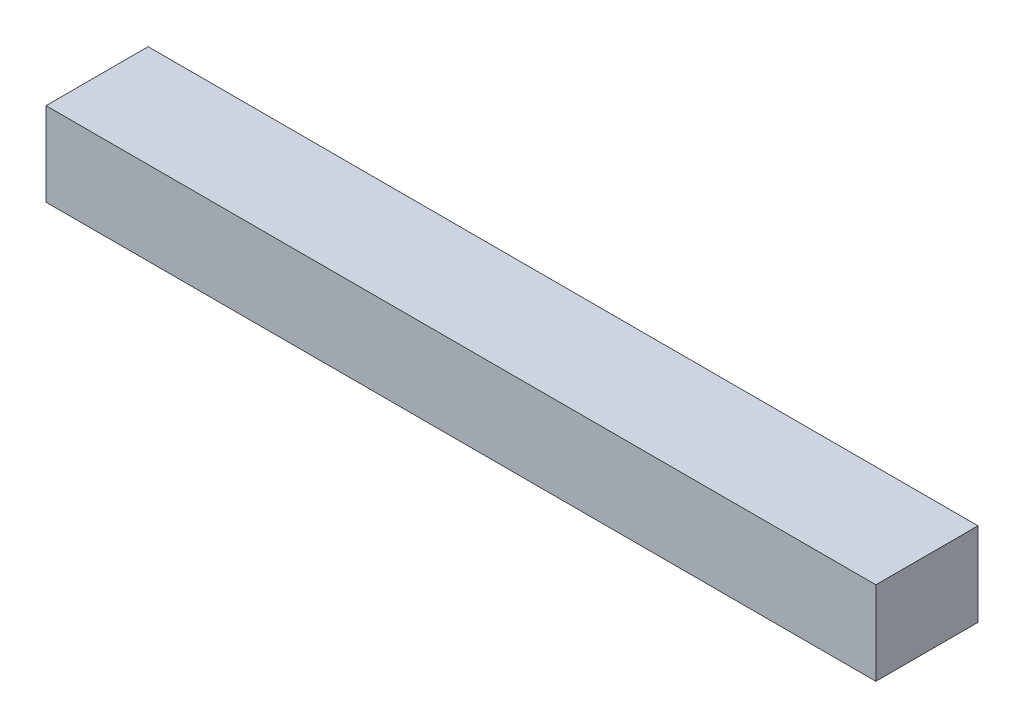
ISO-10303-21;
HEADER;
FILE_DESCRIPTION(('STEP AP214'),'2;1');
FILE_NAME('part.step','',(''),(''),'','','');
FILE_SCHEMA(('AUTOMOTIVE_DESIGN { 1 0 10303 214 1 1 1 1 }'));
ENDSEC;
DATA;
#1=APPLICATION_CONTEXT('core data for automotive mechanical design processes');
#2=APPLICATION_PROTOCOL_DEFINITION('international standard','automotive_design',2000,#1);
#3=PRODUCT_CONTEXT('',#1,'mechanical');
#4=PRODUCT('Part','Part','',(#3));
#5=PRODUCT_RELATED_PRODUCT_CATEGORY('part','',(#4));
#6=PRODUCT_DEFINITION_FORMATION('','',#4);
#7=PRODUCT_DEFINITION_CONTEXT('part definition',#1,'design');
#8=PRODUCT_DEFINITION('design','',#6,#7);
#9=PRODUCT_DEFINITION_SHAPE('','',#8);
#10=(LENGTH_UNIT() NAMED_UNIT(*) SI_UNIT(.MILLI.,.METRE.));
#11=(NAMED_UNIT(*) PLANE_ANGLE_UNIT() SI_UNIT($,.RADIAN.));
#12=(NAMED_UNIT(*) SI_UNIT($,.STERADIAN.) SOLID_ANGLE_UNIT());
#13=UNCERTAINTY_MEASURE_WITH_UNIT(LENGTH_MEASURE(1.E-05),#10,'distance_accuracy_value','');
#14=(GEOMETRIC_REPRESENTATION_CONTEXT(3) GLOBAL_UNCERTAINTY_ASSIGNED_CONTEXT((#13)) GLOBAL_UNIT_ASSIGNED_CONTEXT((#10,
#11,#12)) REPRESENTATION_CONTEXT('',''));
#15=CARTESIAN_POINT('',(0.,0.,0.));
#16=DIRECTION('',(0.,0.,1.));
#17=DIRECTION('',(1.,0.,0.));
#18=AXIS2_PLACEMENT_3D('',#15,#16,#17);
#19=CARTESIAN_POINT('',(2600.,0.,0.));
#20=DIRECTION('',(0.,0.,-1.));
#21=DIRECTION('',(-1.,0.,0.));
#22=AXIS2_PLACEMENT_3D('',#19,#20,#21);
#23=PLANE('',#22);
#24=DIRECTION('',(0.,-1.,0.));
#25=VECTOR('',#24,1.);
#26=CARTESIAN_POINT('',(0.,0.,0.));
#27=LINE('',#26,#25);
#28=CARTESIAN_POINT('',(0.,262.,0.));
#29=VERTEX_POINT('',#28);
#30=CARTESIAN_POINT('',(0.,0.,0.));
#31=VERTEX_POINT('',#30);
#32=EDGE_CURVE('E93',#29,#31,#27,.T.);
#33=ORIENTED_EDGE('',*,*,#32,.T.);
#34=DIRECTION('',(-1.,0.,0.));
#35=VECTOR('',#34,1.);
#36=CARTESIAN_POINT('',(2600.,0.,0.));
#37=LINE('',#36,#35);
#38=CARTESIAN_POINT('',(2600.,0.,0.));
#39=VERTEX_POINT('',#38);
#40=EDGE_CURVE('E11',#39,#31,#37,.T.);
#41=ORIENTED_EDGE('',*,*,#40,.F.);
#42=DIRECTION('',(0.,-1.,0.));
#43=VECTOR('',#42,1.);
#44=CARTESIAN_POINT('',(2600.,0.,0.));
#45=LINE('',#44,#43);
#46=CARTESIAN_POINT('',(2600.,262.,0.));
#47=VERTEX_POINT('',#46);
#48=EDGE_CURVE('E81',#47,#39,#45,.T.);
#49=ORIENTED_EDGE('',*,*,#48,.F.);
#50=DIRECTION('',(-1.,0.,0.));
#51=VECTOR('',#50,1.);
#52=CARTESIAN_POINT('',(2600.,262.,0.));
#53=LINE('',#52,#51);
#54=EDGE_CURVE('E89',#47,#29,#53,.T.);
#55=ORIENTED_EDGE('',*,*,#54,.T.);
#56=EDGE_LOOP('',(#33,#41,#49,#55));
#57=FACE_BOUND('',#56,.T.);
#58=ADVANCED_FACE('F30',(#57),#23,.F.);
#59=CARTESIAN_POINT('',(2600.,0.,0.));
#60=DIRECTION('',(0.,1.,0.));
#61=DIRECTION('',(0.,0.,1.));
#62=AXIS2_PLACEMENT_3D('',#59,#60,#61);
#63=PLANE('',#62);
#64=DIRECTION('',(0.,0.,-1.));
#65=VECTOR('',#64,1.);
#66=CARTESIAN_POINT('',(0.,0.,0.));
#67=LINE('',#66,#65);
#68=CARTESIAN_POINT('',(0.,0.,-320.));
#69=VERTEX_POINT('',#68);
#70=EDGE_CURVE('E85',#31,#69,#67,.T.);
#71=ORIENTED_EDGE('',*,*,#70,.T.);
#72=DIRECTION('',(-1.,0.,0.));
#73=VECTOR('',#72,1.);
#74=CARTESIAN_POINT('',(2600.,0.,-320.));
#75=LINE('',#74,#73);
#76=CARTESIAN_POINT('',(2600.,0.,-320.));
#77=VERTEX_POINT('',#76);
#78=EDGE_CURVE('E38',#77,#69,#75,.T.);
#79=ORIENTED_EDGE('',*,*,#78,.F.);
#80=DIRECTION('',(0.,0.,-1.));
#81=VECTOR('',#80,1.);
#82=CARTESIAN_POINT('',(2600.,0.,0.));
#83=LINE('',#82,#81);
#84=EDGE_CURVE('E76',#39,#77,#83,.T.);
#85=ORIENTED_EDGE('',*,*,#84,.F.);
#86=ORIENTED_EDGE('',*,*,#40,.T.);
#87=EDGE_LOOP('',(#71,#79,#85,#86));
#88=FACE_BOUND('',#87,.T.);
#89=ADVANCED_FACE('F84',(#88),#63,.F.);
#90=CARTESIAN_POINT('',(2600.,0.,-320.));
#91=DIRECTION('',(0.,0.,1.));
#92=DIRECTION('',(1.,0.,0.));
#93=AXIS2_PLACEMENT_3D('',#90,#91,#92);
#94=PLANE('',#93);
#95=DIRECTION('',(0.,1.,0.));
#96=VECTOR('',#95,1.);
#97=CARTESIAN_POINT('',(0.,0.,-320.));
#98=LINE('',#97,#96);
#99=CARTESIAN_POINT('',(0.,262.,-320.));
#100=VERTEX_POINT('',#99);
#101=EDGE_CURVE('E63',#69,#100,#98,.T.);
#102=ORIENTED_EDGE('',*,*,#101,.T.);
#103=DIRECTION('',(-1.,0.,0.));
#104=VECTOR('',#103,1.);
#105=CARTESIAN_POINT('',(2600.,262.,-320.));
#106=LINE('',#105,#104);
#107=CARTESIAN_POINT('',(2600.,262.,-320.));
#108=VERTEX_POINT('',#107);
#109=EDGE_CURVE('E86',#108,#100,#106,.T.);
#110=ORIENTED_EDGE('',*,*,#109,.F.);
#111=DIRECTION('',(0.,1.,0.));
#112=VECTOR('',#111,1.);
#113=CARTESIAN_POINT('',(2600.,0.,-320.));
#114=LINE('',#113,#112);
#115=EDGE_CURVE('E79',#77,#108,#114,.T.);
#116=ORIENTED_EDGE('',*,*,#115,.F.);
#117=ORIENTED_EDGE('',*,*,#78,.T.);
#118=EDGE_LOOP('',(#102,#110,#116,#117));
#119=FACE_BOUND('',#118,.T.);
#120=ADVANCED_FACE('F87',(#119),#94,.F.);
#121=CARTESIAN_POINT('',(2600.,262.,0.));
#122=DIRECTION('',(0.,-1.,0.));
#123=DIRECTION('',(0.,0.,-1.));
#124=AXIS2_PLACEMENT_3D('',#121,#122,#123);
#125=PLANE('',#124);
#126=DIRECTION('',(0.,0.,1.));
#127=VECTOR('',#126,1.);
#128=CARTESIAN_POINT('',(0.,262.,0.));
#129=LINE('',#128,#127);
#130=EDGE_CURVE('E69',#100,#29,#129,.T.);
#131=ORIENTED_EDGE('',*,*,#130,.T.);
#132=ORIENTED_EDGE('',*,*,#54,.F.);
#133=DIRECTION('',(0.,0.,1.));
#134=VECTOR('',#133,1.);
#135=CARTESIAN_POINT('',(2600.,262.,0.));
#136=LINE('',#135,#134);
#137=EDGE_CURVE('E46',#108,#47,#136,.T.);
#138=ORIENTED_EDGE('',*,*,#137,.F.);
#139=ORIENTED_EDGE('',*,*,#109,.T.);
#140=EDGE_LOOP('',(#131,#132,#138,#139));
#141=FACE_BOUND('',#140,.T.);
#142=ADVANCED_FACE('F100',(#141),#125,.F.);
#143=CARTESIAN_POINT('',(2600.,0.,0.));
#144=DIRECTION('',(-1.,0.,0.));
#145=DIRECTION('',(0.,0.,1.));
#146=AXIS2_PLACEMENT_3D('',#143,#144,#145);
#147=PLANE('',#146);
#148=ORIENTED_EDGE('',*,*,#48,.T.);
#149=ORIENTED_EDGE('',*,*,#84,.T.);
#150=ORIENTED_EDGE('',*,*,#115,.T.);
#151=ORIENTED_EDGE('',*,*,#137,.T.);
#152=EDGE_LOOP('',(#148,#149,#150,#151));
#153=FACE_BOUND('',#152,.T.);
#154=ADVANCED_FACE('F77',(#153),#147,.F.);
#155=CARTESIAN_POINT('',(0.,0.,0.));
#156=DIRECTION('',(-1.,0.,0.));
#157=DIRECTION('',(0.,0.,1.));
#158=AXIS2_PLACEMENT_3D('',#155,#156,#157);
#159=PLANE('',#158);
#160=ORIENTED_EDGE('',*,*,#32,.F.);
#161=ORIENTED_EDGE('',*,*,#130,.F.);
#162=ORIENTED_EDGE('',*,*,#101,.F.);
#163=ORIENTED_EDGE('',*,*,#70,.F.);
#164=EDGE_LOOP('',(#160,#161,#162,#163));
#165=FACE_BOUND('',#164,.T.);
#166=ADVANCED_FACE('F103',(#165),#159,.T.);
#167=CLOSED_SHELL('',(#58,#89,#120,#142,#154,#166));
#168=MANIFOLD_SOLID_BREP('B2',#167);
#169=ADVANCED_BREP_SHAPE_REPRESENTATION('',(#18,#168),#14);
#170=SHAPE_DEFINITION_REPRESENTATION(#9,#169);
ENDSEC;
END-ISO-10303-21;
